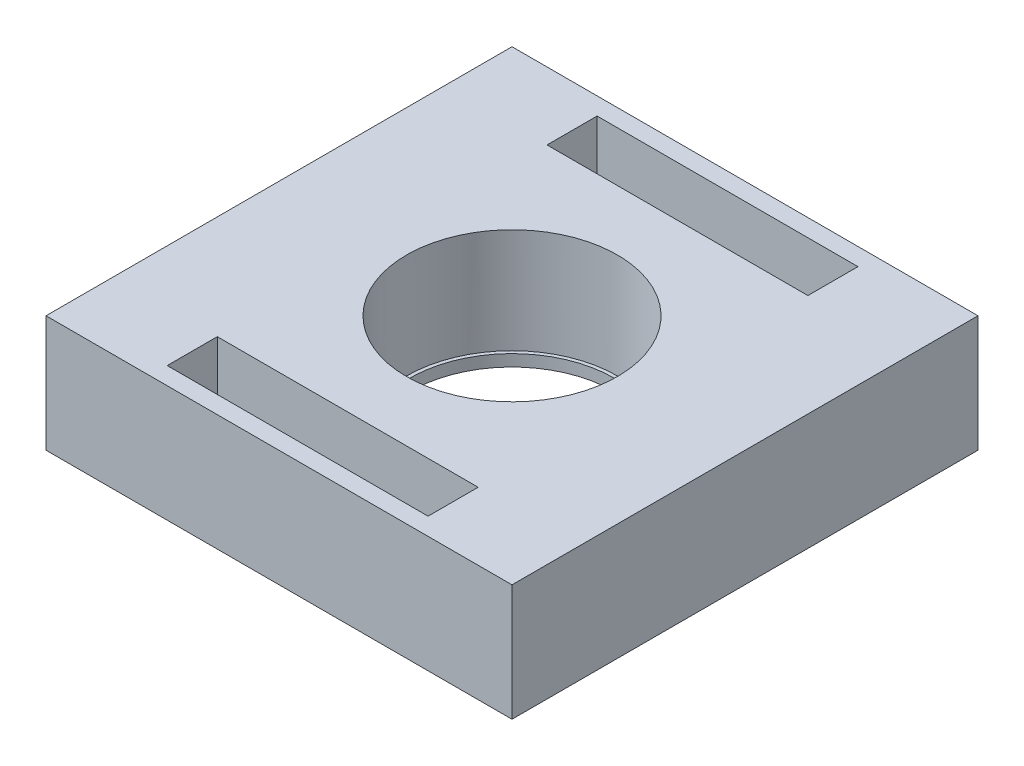
ISO-10303-21;
HEADER;
FILE_DESCRIPTION(('STEP AP214'),'2;1');
FILE_NAME('part.step','',(''),(''),'','','');
FILE_SCHEMA(('AUTOMOTIVE_DESIGN { 1 0 10303 214 1 1 1 1 }'));
ENDSEC;
DATA;
#1=APPLICATION_CONTEXT('core data for automotive mechanical design processes');
#2=APPLICATION_PROTOCOL_DEFINITION('international standard','automotive_design',2000,#1);
#3=PRODUCT_CONTEXT('',#1,'mechanical');
#4=PRODUCT('Part','Part','',(#3));
#5=PRODUCT_RELATED_PRODUCT_CATEGORY('part','',(#4));
#6=PRODUCT_DEFINITION_FORMATION('','',#4);
#7=PRODUCT_DEFINITION_CONTEXT('part definition',#1,'design');
#8=PRODUCT_DEFINITION('design','',#6,#7);
#9=PRODUCT_DEFINITION_SHAPE('','',#8);
#10=(LENGTH_UNIT() NAMED_UNIT(*) SI_UNIT(.MILLI.,.METRE.));
#11=(NAMED_UNIT(*) PLANE_ANGLE_UNIT() SI_UNIT($,.RADIAN.));
#12=(NAMED_UNIT(*) SI_UNIT($,.STERADIAN.) SOLID_ANGLE_UNIT());
#13=UNCERTAINTY_MEASURE_WITH_UNIT(LENGTH_MEASURE(1.E-05),#10,'distance_accuracy_value','');
#14=(GEOMETRIC_REPRESENTATION_CONTEXT(3) GLOBAL_UNCERTAINTY_ASSIGNED_CONTEXT((#13)) GLOBAL_UNIT_ASSIGNED_CONTEXT((#10,
#11,#12)) REPRESENTATION_CONTEXT('',''));
#15=CARTESIAN_POINT('',(0.,0.,0.));
#16=DIRECTION('',(0.,0.,1.));
#17=DIRECTION('',(1.,0.,0.));
#18=AXIS2_PLACEMENT_3D('',#15,#16,#17);
#19=CARTESIAN_POINT('',(0.,0.,0.));
#20=DIRECTION('',(0.,-1.,0.));
#21=DIRECTION('',(0.,0.,-1.));
#22=AXIS2_PLACEMENT_3D('',#19,#20,#21);
#23=PLANE('',#22);
#24=CARTESIAN_POINT('',(0.,0.,0.));
#25=DIRECTION('',(0.,1.,0.));
#26=DIRECTION('',(0.,0.,1.));
#27=AXIS2_PLACEMENT_3D('',#24,#25,#26);
#28=CIRCLE('',#27,9.05);
#29=CARTESIAN_POINT('',(0.,0.,9.05));
#30=VERTEX_POINT('',#29);
#31=EDGE_CURVE('E160',#30,#30,#28,.T.);
#32=ORIENTED_EDGE('',*,*,#31,.F.);
#33=EDGE_LOOP('',(#32));
#34=FACE_BOUND('',#33,.T.);
#35=DIRECTION('',(0.,0.,-1.));
#36=VECTOR('',#35,1.);
#37=CARTESIAN_POINT('',(11.3,0.,0.));
#38=LINE('',#37,#36);
#39=CARTESIAN_POINT('',(11.3,0.,18.5075863736734));
#40=VERTEX_POINT('',#39);
#41=CARTESIAN_POINT('',(11.3,0.,14.2075863736734));
#42=VERTEX_POINT('',#41);
#43=EDGE_CURVE('E159',#40,#42,#38,.T.);
#44=ORIENTED_EDGE('',*,*,#43,.F.);
#45=DIRECTION('',(1.,0.,0.));
#46=VECTOR('',#45,1.);
#47=CARTESIAN_POINT('',(0.,0.,18.5075863736734));
#48=LINE('',#47,#46);
#49=CARTESIAN_POINT('',(-11.1,0.,18.5075863736734));
#50=VERTEX_POINT('',#49);
#51=EDGE_CURVE('E52',#50,#40,#48,.T.);
#52=ORIENTED_EDGE('',*,*,#51,.F.);
#53=DIRECTION('',(0.,0.,1.));
#54=VECTOR('',#53,1.);
#55=CARTESIAN_POINT('',(-11.1,0.,0.));
#56=LINE('',#55,#54);
#57=CARTESIAN_POINT('',(-11.1,0.,14.2075863736734));
#58=VERTEX_POINT('',#57);
#59=EDGE_CURVE('E147',#58,#50,#56,.T.);
#60=ORIENTED_EDGE('',*,*,#59,.F.);
#61=DIRECTION('',(1.,0.,0.));
#62=VECTOR('',#61,1.);
#63=CARTESIAN_POINT('',(0.,0.,14.2075863736734));
#64=LINE('',#63,#62);
#65=EDGE_CURVE('E150',#58,#42,#64,.T.);
#66=ORIENTED_EDGE('',*,*,#65,.T.);
#67=EDGE_LOOP('',(#44,#52,#60,#66));
#68=FACE_BOUND('',#67,.T.);
#69=DIRECTION('',(0.,0.,-1.));
#70=VECTOR('',#69,1.);
#71=CARTESIAN_POINT('',(20.0075863736734,0.,20.0075863736734));
#72=LINE('',#71,#70);
#73=CARTESIAN_POINT('',(20.0075863736734,0.,20.0075863736734));
#74=VERTEX_POINT('',#73);
#75=CARTESIAN_POINT('',(20.0075863736734,0.,-20.0075863736734));
#76=VERTEX_POINT('',#75);
#77=EDGE_CURVE('E199',#74,#76,#72,.T.);
#78=ORIENTED_EDGE('',*,*,#77,.T.);
#79=DIRECTION('',(-1.,0.,0.));
#80=VECTOR('',#79,1.);
#81=CARTESIAN_POINT('',(-20.0075863736734,0.,-20.0075863736734));
#82=LINE('',#81,#80);
#83=CARTESIAN_POINT('',(-20.0075863736734,0.,-20.0075863736734));
#84=VERTEX_POINT('',#83);
#85=EDGE_CURVE('E215',#76,#84,#82,.T.);
#86=ORIENTED_EDGE('',*,*,#85,.T.);
#87=DIRECTION('',(0.,0.,1.));
#88=VECTOR('',#87,1.);
#89=CARTESIAN_POINT('',(-20.0075863736734,0.,20.0075863736734));
#90=LINE('',#89,#88);
#91=CARTESIAN_POINT('',(-20.0075863736734,0.,20.0075863736734));
#92=VERTEX_POINT('',#91);
#93=EDGE_CURVE('E218',#84,#92,#90,.T.);
#94=ORIENTED_EDGE('',*,*,#93,.T.);
#95=DIRECTION('',(1.,0.,0.));
#96=VECTOR('',#95,1.);
#97=CARTESIAN_POINT('',(-20.0075863736734,0.,20.0075863736734));
#98=LINE('',#97,#96);
#99=EDGE_CURVE('E204',#92,#74,#98,.T.);
#100=ORIENTED_EDGE('',*,*,#99,.T.);
#101=EDGE_LOOP('',(#78,#86,#94,#100));
#102=FACE_BOUND('',#101,.T.);
#103=DIRECTION('',(0.,0.,1.));
#104=VECTOR('',#103,1.);
#105=CARTESIAN_POINT('',(11.2,0.,0.));
#106=LINE('',#105,#104);
#107=CARTESIAN_POINT('',(11.2,0.,-18.5075863736734));
#108=VERTEX_POINT('',#107);
#109=CARTESIAN_POINT('',(11.2,0.,-14.2075863736734));
#110=VERTEX_POINT('',#109);
#111=EDGE_CURVE('E60',#108,#110,#106,.T.);
#112=ORIENTED_EDGE('',*,*,#111,.T.);
#113=DIRECTION('',(-1.,0.,0.));
#114=VECTOR('',#113,1.);
#115=CARTESIAN_POINT('',(0.,0.,-14.2075863736734));
#116=LINE('',#115,#114);
#117=CARTESIAN_POINT('',(-11.2,0.,-14.2075863736734));
#118=VERTEX_POINT('',#117);
#119=EDGE_CURVE('E173',#110,#118,#116,.T.);
#120=ORIENTED_EDGE('',*,*,#119,.T.);
#121=DIRECTION('',(0.,0.,-1.));
#122=VECTOR('',#121,1.);
#123=CARTESIAN_POINT('',(-11.2,0.,0.));
#124=LINE('',#123,#122);
#125=CARTESIAN_POINT('',(-11.2,0.,-18.5075863736734));
#126=VERTEX_POINT('',#125);
#127=EDGE_CURVE('E184',#118,#126,#124,.T.);
#128=ORIENTED_EDGE('',*,*,#127,.T.);
#129=DIRECTION('',(1.,0.,0.));
#130=VECTOR('',#129,1.);
#131=CARTESIAN_POINT('',(0.,0.,-18.5075863736734));
#132=LINE('',#131,#130);
#133=EDGE_CURVE('E181',#126,#108,#132,.T.);
#134=ORIENTED_EDGE('',*,*,#133,.T.);
#135=EDGE_LOOP('',(#112,#120,#128,#134));
#136=FACE_BOUND('',#135,.T.);
#137=ADVANCED_FACE('F35',(#34,#68,#102,#136),#23,.F.);
#138=CARTESIAN_POINT('',(20.0075863736734,-10.,20.0075863736734));
#139=DIRECTION('',(1.,0.,0.));
#140=DIRECTION('',(0.,0.,-1.));
#141=AXIS2_PLACEMENT_3D('',#138,#139,#140);
#142=PLANE('',#141);
#143=ORIENTED_EDGE('',*,*,#77,.F.);
#144=DIRECTION('',(0.,1.,0.));
#145=VECTOR('',#144,1.);
#146=CARTESIAN_POINT('',(20.0075863736734,-10.,20.0075863736734));
#147=LINE('',#146,#145);
#148=CARTESIAN_POINT('',(20.0075863736734,-10.,20.0075863736734));
#149=VERTEX_POINT('',#148);
#150=EDGE_CURVE('E12',#149,#74,#147,.T.);
#151=ORIENTED_EDGE('',*,*,#150,.F.);
#152=DIRECTION('',(0.,0.,-1.));
#153=VECTOR('',#152,1.);
#154=CARTESIAN_POINT('',(20.0075863736734,-10.,20.0075863736734));
#155=LINE('',#154,#153);
#156=CARTESIAN_POINT('',(20.0075863736734,-10.,-20.0075863736734));
#157=VERTEX_POINT('',#156);
#158=EDGE_CURVE('E200',#149,#157,#155,.T.);
#159=ORIENTED_EDGE('',*,*,#158,.T.);
#160=DIRECTION('',(0.,1.,0.));
#161=VECTOR('',#160,1.);
#162=CARTESIAN_POINT('',(20.0075863736734,-10.,-20.0075863736734));
#163=LINE('',#162,#161);
#164=EDGE_CURVE('E39',#157,#76,#163,.T.);
#165=ORIENTED_EDGE('',*,*,#164,.T.);
#166=EDGE_LOOP('',(#143,#151,#159,#165));
#167=FACE_BOUND('',#166,.T.);
#168=ADVANCED_FACE('F37',(#167),#142,.T.);
#169=CARTESIAN_POINT('',(-20.0075863736734,-10.,20.0075863736734));
#170=DIRECTION('',(0.,0.,1.));
#171=DIRECTION('',(1.,0.,0.));
#172=AXIS2_PLACEMENT_3D('',#169,#170,#171);
#173=PLANE('',#172);
#174=ORIENTED_EDGE('',*,*,#99,.F.);
#175=DIRECTION('',(0.,1.,0.));
#176=VECTOR('',#175,1.);
#177=CARTESIAN_POINT('',(-20.0075863736734,-10.,20.0075863736734));
#178=LINE('',#177,#176);
#179=CARTESIAN_POINT('',(-20.0075863736734,-10.,20.0075863736734));
#180=VERTEX_POINT('',#179);
#181=EDGE_CURVE('E44',#180,#92,#178,.T.);
#182=ORIENTED_EDGE('',*,*,#181,.F.);
#183=DIRECTION('',(1.,0.,0.));
#184=VECTOR('',#183,1.);
#185=CARTESIAN_POINT('',(-20.0075863736734,-10.,20.0075863736734));
#186=LINE('',#185,#184);
#187=EDGE_CURVE('E210',#180,#149,#186,.T.);
#188=ORIENTED_EDGE('',*,*,#187,.T.);
#189=ORIENTED_EDGE('',*,*,#150,.T.);
#190=EDGE_LOOP('',(#174,#182,#188,#189));
#191=FACE_BOUND('',#190,.T.);
#192=ADVANCED_FACE('F236',(#191),#173,.T.);
#193=CARTESIAN_POINT('',(-20.0075863736734,-10.,20.0075863736734));
#194=DIRECTION('',(-1.,0.,0.));
#195=DIRECTION('',(0.,0.,1.));
#196=AXIS2_PLACEMENT_3D('',#193,#194,#195);
#197=PLANE('',#196);
#198=ORIENTED_EDGE('',*,*,#93,.F.);
#199=DIRECTION('',(0.,1.,0.));
#200=VECTOR('',#199,1.);
#201=CARTESIAN_POINT('',(-20.0075863736734,-10.,-20.0075863736734));
#202=LINE('',#201,#200);
#203=CARTESIAN_POINT('',(-20.0075863736734,-10.,-20.0075863736734));
#204=VERTEX_POINT('',#203);
#205=EDGE_CURVE('E223',#204,#84,#202,.T.);
#206=ORIENTED_EDGE('',*,*,#205,.F.);
#207=DIRECTION('',(0.,0.,1.));
#208=VECTOR('',#207,1.);
#209=CARTESIAN_POINT('',(-20.0075863736734,-10.,20.0075863736734));
#210=LINE('',#209,#208);
#211=EDGE_CURVE('E207',#204,#180,#210,.T.);
#212=ORIENTED_EDGE('',*,*,#211,.T.);
#213=ORIENTED_EDGE('',*,*,#181,.T.);
#214=EDGE_LOOP('',(#198,#206,#212,#213));
#215=FACE_BOUND('',#214,.T.);
#216=ADVANCED_FACE('F242',(#215),#197,.T.);
#217=CARTESIAN_POINT('',(-20.0075863736734,-10.,-20.0075863736734));
#218=DIRECTION('',(0.,0.,-1.));
#219=DIRECTION('',(-1.,0.,0.));
#220=AXIS2_PLACEMENT_3D('',#217,#218,#219);
#221=PLANE('',#220);
#222=ORIENTED_EDGE('',*,*,#85,.F.);
#223=ORIENTED_EDGE('',*,*,#164,.F.);
#224=DIRECTION('',(-1.,0.,0.));
#225=VECTOR('',#224,1.);
#226=CARTESIAN_POINT('',(-20.0075863736734,-10.,-20.0075863736734));
#227=LINE('',#226,#225);
#228=EDGE_CURVE('E203',#157,#204,#227,.T.);
#229=ORIENTED_EDGE('',*,*,#228,.T.);
#230=ORIENTED_EDGE('',*,*,#205,.T.);
#231=EDGE_LOOP('',(#222,#223,#229,#230));
#232=FACE_BOUND('',#231,.T.);
#233=ADVANCED_FACE('F231',(#232),#221,.T.);
#234=CARTESIAN_POINT('',(0.,-10.,0.));
#235=DIRECTION('',(0.,-1.,0.));
#236=DIRECTION('',(0.,0.,-1.));
#237=AXIS2_PLACEMENT_3D('',#234,#235,#236);
#238=PLANE('',#237);
#239=CARTESIAN_POINT('',(0.,-10.,0.));
#240=DIRECTION('',(0.,1.,0.));
#241=DIRECTION('',(0.,0.,1.));
#242=AXIS2_PLACEMENT_3D('',#239,#240,#241);
#243=CIRCLE('',#242,8.75);
#244=CARTESIAN_POINT('',(0.,-10.,8.75));
#245=VERTEX_POINT('',#244);
#246=EDGE_CURVE('E191',#245,#245,#243,.T.);
#247=ORIENTED_EDGE('',*,*,#246,.T.);
#248=EDGE_LOOP('',(#247));
#249=FACE_BOUND('',#248,.T.);
#250=ORIENTED_EDGE('',*,*,#158,.F.);
#251=ORIENTED_EDGE('',*,*,#187,.F.);
#252=ORIENTED_EDGE('',*,*,#211,.F.);
#253=ORIENTED_EDGE('',*,*,#228,.F.);
#254=EDGE_LOOP('',(#250,#251,#252,#253));
#255=FACE_BOUND('',#254,.T.);
#256=ADVANCED_FACE('F239',(#249,#255),#238,.T.);
#257=CARTESIAN_POINT('',(0.,-10.,0.));
#258=DIRECTION('',(0.,1.,0.));
#259=DIRECTION('',(0.,0.,1.));
#260=AXIS2_PLACEMENT_3D('',#257,#258,#259);
#261=CYLINDRICAL_SURFACE('',#260,8.75);
#262=CARTESIAN_POINT('',(0.,-9.,0.));
#263=DIRECTION('',(0.,-1.,0.));
#264=DIRECTION('',(0.,0.,-1.));
#265=AXIS2_PLACEMENT_3D('',#262,#263,#264);
#266=CIRCLE('',#265,8.75);
#267=CARTESIAN_POINT('',(0.,-9.,-8.75));
#268=VERTEX_POINT('',#267);
#269=EDGE_CURVE('E153',#268,#268,#266,.T.);
#270=ORIENTED_EDGE('',*,*,#269,.F.);
#271=EDGE_LOOP('',(#270));
#272=FACE_BOUND('',#271,.T.);
#273=ORIENTED_EDGE('',*,*,#246,.F.);
#274=EDGE_LOOP('',(#273));
#275=FACE_BOUND('',#274,.T.);
#276=ADVANCED_FACE('F261',(#272,#275),#261,.F.);
#277=CARTESIAN_POINT('',(11.2,-6.7,0.));
#278=DIRECTION('',(-1.,0.,0.));
#279=DIRECTION('',(0.,0.,1.));
#280=AXIS2_PLACEMENT_3D('',#277,#278,#279);
#281=PLANE('',#280);
#282=ORIENTED_EDGE('',*,*,#111,.F.);
#283=DIRECTION('',(0.,1.,0.));
#284=VECTOR('',#283,1.);
#285=CARTESIAN_POINT('',(11.2,-6.7,-18.5075863736734));
#286=LINE('',#285,#284);
#287=CARTESIAN_POINT('',(11.2,-6.7,-18.5075863736734));
#288=VERTEX_POINT('',#287);
#289=EDGE_CURVE('E179',#288,#108,#286,.T.);
#290=ORIENTED_EDGE('',*,*,#289,.F.);
#291=DIRECTION('',(0.,0.,1.));
#292=VECTOR('',#291,1.);
#293=CARTESIAN_POINT('',(11.2,-6.7,0.));
#294=LINE('',#293,#292);
#295=CARTESIAN_POINT('',(11.2,-6.7,-14.2075863736734));
#296=VERTEX_POINT('',#295);
#297=EDGE_CURVE('E169',#288,#296,#294,.T.);
#298=ORIENTED_EDGE('',*,*,#297,.T.);
#299=DIRECTION('',(0.,1.,0.));
#300=VECTOR('',#299,1.);
#301=CARTESIAN_POINT('',(11.2,-6.7,-14.2075863736734));
#302=LINE('',#301,#300);
#303=EDGE_CURVE('E189',#296,#110,#302,.T.);
#304=ORIENTED_EDGE('',*,*,#303,.T.);
#305=EDGE_LOOP('',(#282,#290,#298,#304));
#306=FACE_BOUND('',#305,.T.);
#307=ADVANCED_FACE('F265',(#306),#281,.T.);
#308=CARTESIAN_POINT('',(0.,-6.7,-14.2075863736734));
#309=DIRECTION('',(0.,0.,-1.));
#310=DIRECTION('',(-1.,0.,0.));
#311=AXIS2_PLACEMENT_3D('',#308,#309,#310);
#312=PLANE('',#311);
#313=ORIENTED_EDGE('',*,*,#119,.F.);
#314=ORIENTED_EDGE('',*,*,#303,.F.);
#315=DIRECTION('',(-1.,0.,0.));
#316=VECTOR('',#315,1.);
#317=CARTESIAN_POINT('',(0.,-6.7,-14.2075863736734));
#318=LINE('',#317,#316);
#319=CARTESIAN_POINT('',(-11.2,-6.7,-14.2075863736734));
#320=VERTEX_POINT('',#319);
#321=EDGE_CURVE('E177',#296,#320,#318,.T.);
#322=ORIENTED_EDGE('',*,*,#321,.T.);
#323=DIRECTION('',(0.,1.,0.));
#324=VECTOR('',#323,1.);
#325=CARTESIAN_POINT('',(-11.2,-6.7,-14.2075863736734));
#326=LINE('',#325,#324);
#327=EDGE_CURVE('E192',#320,#118,#326,.T.);
#328=ORIENTED_EDGE('',*,*,#327,.T.);
#329=EDGE_LOOP('',(#313,#314,#322,#328));
#330=FACE_BOUND('',#329,.T.);
#331=ADVANCED_FACE('F269',(#330),#312,.T.);
#332=CARTESIAN_POINT('',(-11.2,-6.7,0.));
#333=DIRECTION('',(1.,0.,0.));
#334=DIRECTION('',(0.,0.,-1.));
#335=AXIS2_PLACEMENT_3D('',#332,#333,#334);
#336=PLANE('',#335);
#337=ORIENTED_EDGE('',*,*,#127,.F.);
#338=ORIENTED_EDGE('',*,*,#327,.F.);
#339=DIRECTION('',(0.,0.,-1.));
#340=VECTOR('',#339,1.);
#341=CARTESIAN_POINT('',(-11.2,-6.7,0.));
#342=LINE('',#341,#340);
#343=CARTESIAN_POINT('',(-11.2,-6.7,-18.5075863736734));
#344=VERTEX_POINT('',#343);
#345=EDGE_CURVE('E175',#320,#344,#342,.T.);
#346=ORIENTED_EDGE('',*,*,#345,.T.);
#347=DIRECTION('',(0.,1.,0.));
#348=VECTOR('',#347,1.);
#349=CARTESIAN_POINT('',(-11.2,-6.7,-18.5075863736734));
#350=LINE('',#349,#348);
#351=EDGE_CURVE('E194',#344,#126,#350,.T.);
#352=ORIENTED_EDGE('',*,*,#351,.T.);
#353=EDGE_LOOP('',(#337,#338,#346,#352));
#354=FACE_BOUND('',#353,.T.);
#355=ADVANCED_FACE('F274',(#354),#336,.T.);
#356=CARTESIAN_POINT('',(0.,-6.7,-18.5075863736734));
#357=DIRECTION('',(0.,0.,1.));
#358=DIRECTION('',(1.,0.,0.));
#359=AXIS2_PLACEMENT_3D('',#356,#357,#358);
#360=PLANE('',#359);
#361=ORIENTED_EDGE('',*,*,#133,.F.);
#362=ORIENTED_EDGE('',*,*,#351,.F.);
#363=DIRECTION('',(1.,0.,0.));
#364=VECTOR('',#363,1.);
#365=CARTESIAN_POINT('',(0.,-6.7,-18.5075863736734));
#366=LINE('',#365,#364);
#367=EDGE_CURVE('E172',#344,#288,#366,.T.);
#368=ORIENTED_EDGE('',*,*,#367,.T.);
#369=ORIENTED_EDGE('',*,*,#289,.T.);
#370=EDGE_LOOP('',(#361,#362,#368,#369));
#371=FACE_BOUND('',#370,.T.);
#372=ADVANCED_FACE('F270',(#371),#360,.T.);
#373=CARTESIAN_POINT('',(0.,-6.7,0.));
#374=DIRECTION('',(0.,1.,0.));
#375=DIRECTION('',(0.,0.,1.));
#376=AXIS2_PLACEMENT_3D('',#373,#374,#375);
#377=PLANE('',#376);
#378=ORIENTED_EDGE('',*,*,#297,.F.);
#379=ORIENTED_EDGE('',*,*,#367,.F.);
#380=ORIENTED_EDGE('',*,*,#345,.F.);
#381=ORIENTED_EDGE('',*,*,#321,.F.);
#382=EDGE_LOOP('',(#378,#379,#380,#381));
#383=FACE_BOUND('',#382,.T.);
#384=ADVANCED_FACE('F273',(#383),#377,.T.);
#385=CARTESIAN_POINT('',(0.,-6.7,18.5075863736734));
#386=DIRECTION('',(0.,0.,1.));
#387=DIRECTION('',(1.,0.,0.));
#388=AXIS2_PLACEMENT_3D('',#385,#386,#387);
#389=PLANE('',#388);
#390=ORIENTED_EDGE('',*,*,#51,.T.);
#391=DIRECTION('',(0.,1.,0.));
#392=VECTOR('',#391,1.);
#393=CARTESIAN_POINT('',(11.3,-6.7,18.5075863736734));
#394=LINE('',#393,#392);
#395=CARTESIAN_POINT('',(11.3,-6.7,18.5075863736734));
#396=VERTEX_POINT('',#395);
#397=EDGE_CURVE('E125',#396,#40,#394,.T.);
#398=ORIENTED_EDGE('',*,*,#397,.F.);
#399=DIRECTION('',(1.,0.,0.));
#400=VECTOR('',#399,1.);
#401=CARTESIAN_POINT('',(0.,-6.7,18.5075863736734));
#402=LINE('',#401,#400);
#403=CARTESIAN_POINT('',(-11.1,-6.7,18.5075863736734));
#404=VERTEX_POINT('',#403);
#405=EDGE_CURVE('E129',#404,#396,#402,.T.);
#406=ORIENTED_EDGE('',*,*,#405,.F.);
#407=DIRECTION('',(0.,1.,0.));
#408=VECTOR('',#407,1.);
#409=CARTESIAN_POINT('',(-11.1,-6.7,18.5075863736734));
#410=LINE('',#409,#408);
#411=EDGE_CURVE('E164',#404,#50,#410,.T.);
#412=ORIENTED_EDGE('',*,*,#411,.T.);
#413=EDGE_LOOP('',(#390,#398,#406,#412));
#414=FACE_BOUND('',#413,.T.);
#415=ADVANCED_FACE('F127',(#414),#389,.F.);
#416=CARTESIAN_POINT('',(-11.1,-6.7,0.));
#417=DIRECTION('',(-1.,0.,0.));
#418=DIRECTION('',(0.,0.,1.));
#419=AXIS2_PLACEMENT_3D('',#416,#417,#418);
#420=PLANE('',#419);
#421=ORIENTED_EDGE('',*,*,#59,.T.);
#422=ORIENTED_EDGE('',*,*,#411,.F.);
#423=DIRECTION('',(0.,0.,1.));
#424=VECTOR('',#423,1.);
#425=CARTESIAN_POINT('',(-11.1,-6.7,0.));
#426=LINE('',#425,#424);
#427=CARTESIAN_POINT('',(-11.1,-6.7,14.2075863736734));
#428=VERTEX_POINT('',#427);
#429=EDGE_CURVE('E135',#428,#404,#426,.T.);
#430=ORIENTED_EDGE('',*,*,#429,.F.);
#431=DIRECTION('',(0.,1.,0.));
#432=VECTOR('',#431,1.);
#433=CARTESIAN_POINT('',(-11.1,-6.7,14.2075863736734));
#434=LINE('',#433,#432);
#435=EDGE_CURVE('E166',#428,#58,#434,.T.);
#436=ORIENTED_EDGE('',*,*,#435,.T.);
#437=EDGE_LOOP('',(#421,#422,#430,#436));
#438=FACE_BOUND('',#437,.T.);
#439=ADVANCED_FACE('F287',(#438),#420,.F.);
#440=CARTESIAN_POINT('',(0.,-6.7,14.2075863736734));
#441=DIRECTION('',(0.,0.,1.));
#442=DIRECTION('',(1.,0.,0.));
#443=AXIS2_PLACEMENT_3D('',#440,#441,#442);
#444=PLANE('',#443);
#445=ORIENTED_EDGE('',*,*,#65,.F.);
#446=ORIENTED_EDGE('',*,*,#435,.F.);
#447=DIRECTION('',(1.,0.,0.));
#448=VECTOR('',#447,1.);
#449=CARTESIAN_POINT('',(0.,-6.7,14.2075863736734));
#450=LINE('',#449,#448);
#451=CARTESIAN_POINT('',(11.3,-6.7,14.2075863736734));
#452=VERTEX_POINT('',#451);
#453=EDGE_CURVE('E143',#428,#452,#450,.T.);
#454=ORIENTED_EDGE('',*,*,#453,.T.);
#455=DIRECTION('',(0.,1.,0.));
#456=VECTOR('',#455,1.);
#457=CARTESIAN_POINT('',(11.3,-6.7,14.2075863736734));
#458=LINE('',#457,#456);
#459=EDGE_CURVE('E134',#452,#42,#458,.T.);
#460=ORIENTED_EDGE('',*,*,#459,.T.);
#461=EDGE_LOOP('',(#445,#446,#454,#460));
#462=FACE_BOUND('',#461,.T.);
#463=ADVANCED_FACE('F290',(#462),#444,.T.);
#464=CARTESIAN_POINT('',(11.3,-6.7,0.));
#465=DIRECTION('',(1.,0.,0.));
#466=DIRECTION('',(0.,0.,-1.));
#467=AXIS2_PLACEMENT_3D('',#464,#465,#466);
#468=PLANE('',#467);
#469=ORIENTED_EDGE('',*,*,#43,.T.);
#470=ORIENTED_EDGE('',*,*,#459,.F.);
#471=DIRECTION('',(0.,0.,-1.));
#472=VECTOR('',#471,1.);
#473=CARTESIAN_POINT('',(11.3,-6.7,0.));
#474=LINE('',#473,#472);
#475=EDGE_CURVE('E139',#396,#452,#474,.T.);
#476=ORIENTED_EDGE('',*,*,#475,.F.);
#477=ORIENTED_EDGE('',*,*,#397,.T.);
#478=EDGE_LOOP('',(#469,#470,#476,#477));
#479=FACE_BOUND('',#478,.T.);
#480=ADVANCED_FACE('F140',(#479),#468,.F.);
#481=CARTESIAN_POINT('',(0.,-6.7,0.));
#482=DIRECTION('',(0.,1.,0.));
#483=DIRECTION('',(0.,0.,1.));
#484=AXIS2_PLACEMENT_3D('',#481,#482,#483);
#485=PLANE('',#484);
#486=ORIENTED_EDGE('',*,*,#405,.T.);
#487=ORIENTED_EDGE('',*,*,#475,.T.);
#488=ORIENTED_EDGE('',*,*,#453,.F.);
#489=ORIENTED_EDGE('',*,*,#429,.T.);
#490=EDGE_LOOP('',(#486,#487,#488,#489));
#491=FACE_BOUND('',#490,.T.);
#492=ADVANCED_FACE('F145',(#491),#485,.T.);
#493=CARTESIAN_POINT('',(0.,-35.597265478953,0.));
#494=DIRECTION('',(0.,1.,0.));
#495=DIRECTION('',(0.,0.,1.));
#496=AXIS2_PLACEMENT_3D('',#493,#494,#495);
#497=CYLINDRICAL_SURFACE('',#496,9.05);
#498=ORIENTED_EDGE('',*,*,#31,.T.);
#499=EDGE_LOOP('',(#498));
#500=FACE_BOUND('',#499,.T.);
#501=CARTESIAN_POINT('',(0.,-9.,0.));
#502=DIRECTION('',(0.,-1.,0.));
#503=DIRECTION('',(0.,0.,-1.));
#504=AXIS2_PLACEMENT_3D('',#501,#502,#503);
#505=CIRCLE('',#504,9.05);
#506=CARTESIAN_POINT('',(0.,-9.,-9.05));
#507=VERTEX_POINT('',#506);
#508=EDGE_CURVE('E311',#507,#507,#505,.F.);
#509=ORIENTED_EDGE('',*,*,#508,.F.);
#510=EDGE_LOOP('',(#509));
#511=FACE_BOUND('',#510,.T.);
#512=ADVANCED_FACE('F299',(#500,#511),#497,.F.);
#513=CARTESIAN_POINT('',(0.,-9.,0.));
#514=DIRECTION('',(0.,-1.,0.));
#515=DIRECTION('',(0.,0.,-1.));
#516=AXIS2_PLACEMENT_3D('',#513,#514,#515);
#517=PLANE('',#516);
#518=ORIENTED_EDGE('',*,*,#508,.T.);
#519=EDGE_LOOP('',(#518));
#520=FACE_BOUND('',#519,.T.);
#521=ORIENTED_EDGE('',*,*,#269,.T.);
#522=EDGE_LOOP('',(#521));
#523=FACE_BOUND('',#522,.T.);
#524=ADVANCED_FACE('F302',(#520,#523),#517,.F.);
#525=CLOSED_SHELL('',(#137,#168,#192,#216,#233,#256,#276,#307,#331,#355,#372,#384,#415,#439,
#463,#480,#492,#512,#524));
#526=MANIFOLD_SOLID_BREP('B2',#525);
#527=ADVANCED_BREP_SHAPE_REPRESENTATION('',(#18,#526),#14);
#528=SHAPE_DEFINITION_REPRESENTATION(#9,#527);
ENDSEC;
END-ISO-10303-21;
